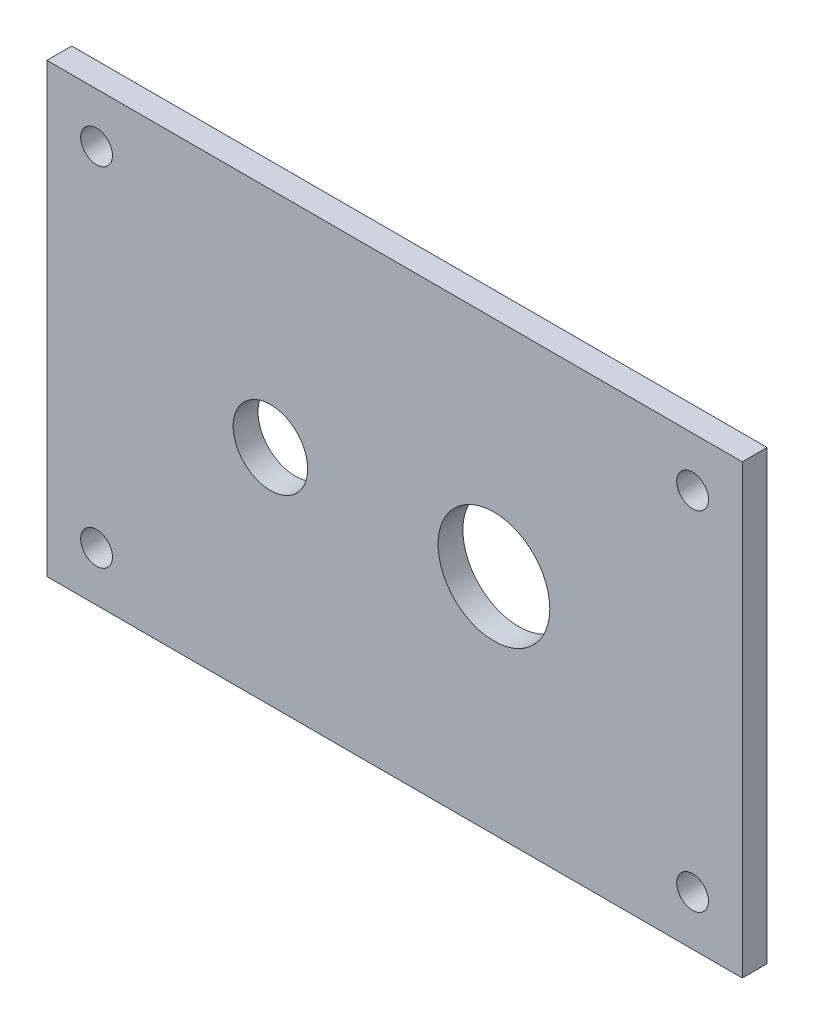
ISO-10303-21;
HEADER;
FILE_DESCRIPTION(('STEP AP214'),'2;1');
FILE_NAME('part.step','',(''),(''),'','','');
FILE_SCHEMA(('AUTOMOTIVE_DESIGN { 1 0 10303 214 1 1 1 1 }'));
ENDSEC;
DATA;
#1=APPLICATION_CONTEXT('core data for automotive mechanical design processes');
#2=APPLICATION_PROTOCOL_DEFINITION('international standard','automotive_design',2000,#1);
#3=PRODUCT_CONTEXT('',#1,'mechanical');
#4=PRODUCT('Part','Part','',(#3));
#5=PRODUCT_RELATED_PRODUCT_CATEGORY('part','',(#4));
#6=PRODUCT_DEFINITION_FORMATION('','',#4);
#7=PRODUCT_DEFINITION_CONTEXT('part definition',#1,'design');
#8=PRODUCT_DEFINITION('design','',#6,#7);
#9=PRODUCT_DEFINITION_SHAPE('','',#8);
#10=(LENGTH_UNIT() NAMED_UNIT(*) SI_UNIT(.MILLI.,.METRE.));
#11=(NAMED_UNIT(*) PLANE_ANGLE_UNIT() SI_UNIT($,.RADIAN.));
#12=(NAMED_UNIT(*) SI_UNIT($,.STERADIAN.) SOLID_ANGLE_UNIT());
#13=UNCERTAINTY_MEASURE_WITH_UNIT(LENGTH_MEASURE(1.E-05),#10,'distance_accuracy_value','');
#14=(GEOMETRIC_REPRESENTATION_CONTEXT(3) GLOBAL_UNCERTAINTY_ASSIGNED_CONTEXT((#13)) GLOBAL_UNIT_ASSIGNED_CONTEXT((#10,
#11,#12)) REPRESENTATION_CONTEXT('',''));
#15=CARTESIAN_POINT('',(0.,0.,0.));
#16=DIRECTION('',(0.,0.,1.));
#17=DIRECTION('',(1.,0.,0.));
#18=AXIS2_PLACEMENT_3D('',#15,#16,#17);
#19=CARTESIAN_POINT('',(0.,0.,3.175));
#20=DIRECTION('',(0.,0.,-1.));
#21=DIRECTION('',(-1.,0.,0.));
#22=AXIS2_PLACEMENT_3D('',#19,#20,#21);
#23=PLANE('',#22);
#24=DIRECTION('',(0.,1.,0.));
#25=VECTOR('',#24,1.);
#26=CARTESIAN_POINT('',(88.9,-57.15,3.175));
#27=LINE('',#26,#25);
#28=CARTESIAN_POINT('',(88.9,-57.15,3.175));
#29=VERTEX_POINT('',#28);
#30=CARTESIAN_POINT('',(88.9,57.15,3.175));
#31=VERTEX_POINT('',#30);
#32=EDGE_CURVE('E87',#29,#31,#27,.T.);
#33=ORIENTED_EDGE('',*,*,#32,.T.);
#34=DIRECTION('',(-1.,0.,0.));
#35=VECTOR('',#34,1.);
#36=CARTESIAN_POINT('',(-88.9,57.15,3.175));
#37=LINE('',#36,#35);
#38=CARTESIAN_POINT('',(-88.9,57.15,3.175));
#39=VERTEX_POINT('',#38);
#40=EDGE_CURVE('E82',#31,#39,#37,.T.);
#41=ORIENTED_EDGE('',*,*,#40,.T.);
#42=DIRECTION('',(0.,-1.,0.));
#43=VECTOR('',#42,1.);
#44=CARTESIAN_POINT('',(-88.9,-57.15,3.175));
#45=LINE('',#44,#43);
#46=CARTESIAN_POINT('',(-88.9,-57.15,3.175));
#47=VERTEX_POINT('',#46);
#48=EDGE_CURVE('E85',#39,#47,#45,.T.);
#49=ORIENTED_EDGE('',*,*,#48,.T.);
#50=DIRECTION('',(1.,0.,0.));
#51=VECTOR('',#50,1.);
#52=CARTESIAN_POINT('',(-88.9,-57.15,3.175));
#53=LINE('',#52,#51);
#54=EDGE_CURVE('E52',#47,#29,#53,.T.);
#55=ORIENTED_EDGE('',*,*,#54,.T.);
#56=EDGE_LOOP('',(#33,#41,#49,#55));
#57=FACE_BOUND('',#56,.T.);
#58=CARTESIAN_POINT('',(25.4,-2.76339623243204E-13,3.175));
#59=DIRECTION('',(0.,0.,1.));
#60=DIRECTION('',(1.,0.,0.));
#61=AXIS2_PLACEMENT_3D('',#58,#59,#60);
#62=CIRCLE('',#61,14.2875);
#63=CARTESIAN_POINT('',(39.6875,-2.76339623243204E-13,3.175));
#64=VERTEX_POINT('',#63);
#65=EDGE_CURVE('E102',#64,#64,#62,.T.);
#66=ORIENTED_EDGE('',*,*,#65,.F.);
#67=EDGE_LOOP('',(#66));
#68=FACE_BOUND('',#67,.T.);
#69=CARTESIAN_POINT('',(-31.75,-2.76339623243204E-13,3.175));
#70=DIRECTION('',(0.,0.,1.));
#71=DIRECTION('',(1.,0.,0.));
#72=AXIS2_PLACEMENT_3D('',#69,#70,#71);
#73=CIRCLE('',#72,9.525);
#74=CARTESIAN_POINT('',(-22.225,-2.76339623243204E-13,3.175));
#75=VERTEX_POINT('',#74);
#76=EDGE_CURVE('E117',#75,#75,#73,.T.);
#77=ORIENTED_EDGE('',*,*,#76,.F.);
#78=EDGE_LOOP('',(#77));
#79=FACE_BOUND('',#78,.T.);
#80=CARTESIAN_POINT('',(-76.2,44.45,3.175));
#81=DIRECTION('',(0.,0.,1.));
#82=DIRECTION('',(1.,0.,0.));
#83=AXIS2_PLACEMENT_3D('',#80,#81,#82);
#84=CIRCLE('',#83,4.064);
#85=CARTESIAN_POINT('',(-72.136,44.45,3.175));
#86=VERTEX_POINT('',#85);
#87=EDGE_CURVE('E123',#86,#86,#84,.T.);
#88=ORIENTED_EDGE('',*,*,#87,.F.);
#89=EDGE_LOOP('',(#88));
#90=FACE_BOUND('',#89,.T.);
#91=CARTESIAN_POINT('',(-76.2,-44.45,3.175));
#92=DIRECTION('',(0.,0.,1.));
#93=DIRECTION('',(-1.,0.,0.));
#94=AXIS2_PLACEMENT_3D('',#91,#92,#93);
#95=CIRCLE('',#94,4.064);
#96=CARTESIAN_POINT('',(-80.264,-44.45,3.175));
#97=VERTEX_POINT('',#96);
#98=EDGE_CURVE('E129',#97,#97,#95,.T.);
#99=ORIENTED_EDGE('',*,*,#98,.F.);
#100=EDGE_LOOP('',(#99));
#101=FACE_BOUND('',#100,.T.);
#102=CARTESIAN_POINT('',(76.2,44.4499999999995,3.175));
#103=DIRECTION('',(0.,0.,1.));
#104=DIRECTION('',(-1.,0.,0.));
#105=AXIS2_PLACEMENT_3D('',#102,#103,#104);
#106=CIRCLE('',#105,4.064);
#107=CARTESIAN_POINT('',(72.136,44.4499999999995,3.175));
#108=VERTEX_POINT('',#107);
#109=EDGE_CURVE('E135',#108,#108,#106,.T.);
#110=ORIENTED_EDGE('',*,*,#109,.F.);
#111=EDGE_LOOP('',(#110));
#112=FACE_BOUND('',#111,.T.);
#113=CARTESIAN_POINT('',(76.2,-44.4500000000004,3.175));
#114=DIRECTION('',(0.,0.,1.));
#115=DIRECTION('',(1.,0.,0.));
#116=AXIS2_PLACEMENT_3D('',#113,#114,#115);
#117=CIRCLE('',#116,4.064);
#118=CARTESIAN_POINT('',(80.264,-44.4500000000004,3.175));
#119=VERTEX_POINT('',#118);
#120=EDGE_CURVE('E141',#119,#119,#117,.T.);
#121=ORIENTED_EDGE('',*,*,#120,.F.);
#122=EDGE_LOOP('',(#121));
#123=FACE_BOUND('',#122,.T.);
#124=ADVANCED_FACE('F35',(#57,#68,#79,#90,#101,#112,#123),#23,.F.);
#125=CARTESIAN_POINT('',(0.,0.,-3.175));
#126=DIRECTION('',(0.,0.,-1.));
#127=DIRECTION('',(-1.,0.,0.));
#128=AXIS2_PLACEMENT_3D('',#125,#126,#127);
#129=PLANE('',#128);
#130=CARTESIAN_POINT('',(76.2,44.4499999999995,-3.175));
#131=DIRECTION('',(0.,0.,1.));
#132=DIRECTION('',(-1.,0.,0.));
#133=AXIS2_PLACEMENT_3D('',#130,#131,#132);
#134=CIRCLE('',#133,4.064);
#135=CARTESIAN_POINT('',(72.136,44.4499999999995,-3.175));
#136=VERTEX_POINT('',#135);
#137=EDGE_CURVE('E138',#136,#136,#134,.T.);
#138=ORIENTED_EDGE('',*,*,#137,.T.);
#139=EDGE_LOOP('',(#138));
#140=FACE_BOUND('',#139,.T.);
#141=CARTESIAN_POINT('',(-76.2,44.45,-3.175));
#142=DIRECTION('',(0.,0.,1.));
#143=DIRECTION('',(1.,0.,0.));
#144=AXIS2_PLACEMENT_3D('',#141,#142,#143);
#145=CIRCLE('',#144,4.064);
#146=CARTESIAN_POINT('',(-72.136,44.45,-3.175));
#147=VERTEX_POINT('',#146);
#148=EDGE_CURVE('E126',#147,#147,#145,.T.);
#149=ORIENTED_EDGE('',*,*,#148,.T.);
#150=EDGE_LOOP('',(#149));
#151=FACE_BOUND('',#150,.T.);
#152=CARTESIAN_POINT('',(25.4,-2.76339623243204E-13,-3.175));
#153=DIRECTION('',(0.,0.,1.));
#154=DIRECTION('',(1.,0.,0.));
#155=AXIS2_PLACEMENT_3D('',#152,#153,#154);
#156=CIRCLE('',#155,14.2875);
#157=CARTESIAN_POINT('',(39.6875,-2.76339623243204E-13,-3.175));
#158=VERTEX_POINT('',#157);
#159=EDGE_CURVE('E114',#158,#158,#156,.T.);
#160=ORIENTED_EDGE('',*,*,#159,.T.);
#161=EDGE_LOOP('',(#160));
#162=FACE_BOUND('',#161,.T.);
#163=DIRECTION('',(0.,1.,0.));
#164=VECTOR('',#163,1.);
#165=CARTESIAN_POINT('',(88.9,-57.15,-3.175));
#166=LINE('',#165,#164);
#167=CARTESIAN_POINT('',(88.9,-57.15,-3.175));
#168=VERTEX_POINT('',#167);
#169=CARTESIAN_POINT('',(88.9,57.15,-3.175));
#170=VERTEX_POINT('',#169);
#171=EDGE_CURVE('E99',#168,#170,#166,.T.);
#172=ORIENTED_EDGE('',*,*,#171,.F.);
#173=DIRECTION('',(1.,0.,0.));
#174=VECTOR('',#173,1.);
#175=CARTESIAN_POINT('',(-88.9,-57.15,-3.175));
#176=LINE('',#175,#174);
#177=CARTESIAN_POINT('',(-88.9,-57.15,-3.175));
#178=VERTEX_POINT('',#177);
#179=EDGE_CURVE('E75',#178,#168,#176,.T.);
#180=ORIENTED_EDGE('',*,*,#179,.F.);
#181=DIRECTION('',(0.,-1.,0.));
#182=VECTOR('',#181,1.);
#183=CARTESIAN_POINT('',(-88.9,-57.15,-3.175));
#184=LINE('',#183,#182);
#185=CARTESIAN_POINT('',(-88.9,57.15,-3.175));
#186=VERTEX_POINT('',#185);
#187=EDGE_CURVE('E69',#186,#178,#184,.T.);
#188=ORIENTED_EDGE('',*,*,#187,.F.);
#189=DIRECTION('',(-1.,0.,0.));
#190=VECTOR('',#189,1.);
#191=CARTESIAN_POINT('',(-88.9,57.15,-3.175));
#192=LINE('',#191,#190);
#193=EDGE_CURVE('E91',#170,#186,#192,.T.);
#194=ORIENTED_EDGE('',*,*,#193,.F.);
#195=EDGE_LOOP('',(#172,#180,#188,#194));
#196=FACE_BOUND('',#195,.T.);
#197=CARTESIAN_POINT('',(-31.75,-2.76339623243204E-13,-3.175));
#198=DIRECTION('',(0.,0.,1.));
#199=DIRECTION('',(1.,0.,0.));
#200=AXIS2_PLACEMENT_3D('',#197,#198,#199);
#201=CIRCLE('',#200,9.525);
#202=CARTESIAN_POINT('',(-22.225,-2.76339623243204E-13,-3.175));
#203=VERTEX_POINT('',#202);
#204=EDGE_CURVE('E120',#203,#203,#201,.T.);
#205=ORIENTED_EDGE('',*,*,#204,.T.);
#206=EDGE_LOOP('',(#205));
#207=FACE_BOUND('',#206,.T.);
#208=CARTESIAN_POINT('',(-76.2,-44.45,-3.175));
#209=DIRECTION('',(0.,0.,1.));
#210=DIRECTION('',(-1.,0.,0.));
#211=AXIS2_PLACEMENT_3D('',#208,#209,#210);
#212=CIRCLE('',#211,4.064);
#213=CARTESIAN_POINT('',(-80.264,-44.45,-3.175));
#214=VERTEX_POINT('',#213);
#215=EDGE_CURVE('E132',#214,#214,#212,.T.);
#216=ORIENTED_EDGE('',*,*,#215,.T.);
#217=EDGE_LOOP('',(#216));
#218=FACE_BOUND('',#217,.T.);
#219=CARTESIAN_POINT('',(76.2,-44.4500000000004,-3.175));
#220=DIRECTION('',(0.,0.,1.));
#221=DIRECTION('',(1.,0.,0.));
#222=AXIS2_PLACEMENT_3D('',#219,#220,#221);
#223=CIRCLE('',#222,4.064);
#224=CARTESIAN_POINT('',(80.264,-44.4500000000004,-3.175));
#225=VERTEX_POINT('',#224);
#226=EDGE_CURVE('E144',#225,#225,#223,.T.);
#227=ORIENTED_EDGE('',*,*,#226,.T.);
#228=EDGE_LOOP('',(#227));
#229=FACE_BOUND('',#228,.T.);
#230=ADVANCED_FACE('F110',(#140,#151,#162,#196,#207,#218,#229),#129,.T.);
#231=CARTESIAN_POINT('',(88.9,-57.15,3.175));
#232=DIRECTION('',(-1.,0.,0.));
#233=DIRECTION('',(0.,0.,1.));
#234=AXIS2_PLACEMENT_3D('',#231,#232,#233);
#235=PLANE('',#234);
#236=ORIENTED_EDGE('',*,*,#171,.T.);
#237=DIRECTION('',(0.,0.,-1.));
#238=VECTOR('',#237,1.);
#239=CARTESIAN_POINT('',(88.9,57.15,3.175));
#240=LINE('',#239,#238);
#241=EDGE_CURVE('E11',#31,#170,#240,.T.);
#242=ORIENTED_EDGE('',*,*,#241,.F.);
#243=ORIENTED_EDGE('',*,*,#32,.F.);
#244=DIRECTION('',(0.,0.,-1.));
#245=VECTOR('',#244,1.);
#246=CARTESIAN_POINT('',(88.9,-57.15,3.175));
#247=LINE('',#246,#245);
#248=EDGE_CURVE('E95',#29,#168,#247,.T.);
#249=ORIENTED_EDGE('',*,*,#248,.T.);
#250=EDGE_LOOP('',(#236,#242,#243,#249));
#251=FACE_BOUND('',#250,.T.);
#252=ADVANCED_FACE('F37',(#251),#235,.F.);
#253=CARTESIAN_POINT('',(-88.9,57.15,3.175));
#254=DIRECTION('',(0.,-1.,0.));
#255=DIRECTION('',(0.,0.,-1.));
#256=AXIS2_PLACEMENT_3D('',#253,#254,#255);
#257=PLANE('',#256);
#258=ORIENTED_EDGE('',*,*,#193,.T.);
#259=DIRECTION('',(0.,0.,-1.));
#260=VECTOR('',#259,1.);
#261=CARTESIAN_POINT('',(-88.9,57.15,3.175));
#262=LINE('',#261,#260);
#263=EDGE_CURVE('E44',#39,#186,#262,.T.);
#264=ORIENTED_EDGE('',*,*,#263,.F.);
#265=ORIENTED_EDGE('',*,*,#40,.F.);
#266=ORIENTED_EDGE('',*,*,#241,.T.);
#267=EDGE_LOOP('',(#258,#264,#265,#266));
#268=FACE_BOUND('',#267,.T.);
#269=ADVANCED_FACE('F90',(#268),#257,.F.);
#270=CARTESIAN_POINT('',(-88.9,-57.15,3.175));
#271=DIRECTION('',(1.,0.,0.));
#272=DIRECTION('',(0.,0.,-1.));
#273=AXIS2_PLACEMENT_3D('',#270,#271,#272);
#274=PLANE('',#273);
#275=ORIENTED_EDGE('',*,*,#187,.T.);
#276=DIRECTION('',(0.,0.,-1.));
#277=VECTOR('',#276,1.);
#278=CARTESIAN_POINT('',(-88.9,-57.15,3.175));
#279=LINE('',#278,#277);
#280=EDGE_CURVE('E92',#47,#178,#279,.T.);
#281=ORIENTED_EDGE('',*,*,#280,.F.);
#282=ORIENTED_EDGE('',*,*,#48,.F.);
#283=ORIENTED_EDGE('',*,*,#263,.T.);
#284=EDGE_LOOP('',(#275,#281,#282,#283));
#285=FACE_BOUND('',#284,.T.);
#286=ADVANCED_FACE('F93',(#285),#274,.F.);
#287=CARTESIAN_POINT('',(-88.9,-57.15,3.175));
#288=DIRECTION('',(0.,1.,0.));
#289=DIRECTION('',(0.,0.,1.));
#290=AXIS2_PLACEMENT_3D('',#287,#288,#289);
#291=PLANE('',#290);
#292=ORIENTED_EDGE('',*,*,#179,.T.);
#293=ORIENTED_EDGE('',*,*,#248,.F.);
#294=ORIENTED_EDGE('',*,*,#54,.F.);
#295=ORIENTED_EDGE('',*,*,#280,.T.);
#296=EDGE_LOOP('',(#292,#293,#294,#295));
#297=FACE_BOUND('',#296,.T.);
#298=ADVANCED_FACE('F107',(#297),#291,.F.);
#299=CARTESIAN_POINT('',(25.4,-2.76339623243204E-13,3.175));
#300=DIRECTION('',(0.,0.,-1.));
#301=DIRECTION('',(-1.,0.,0.));
#302=AXIS2_PLACEMENT_3D('',#299,#300,#301);
#303=CYLINDRICAL_SURFACE('',#302,14.2875);
#304=ORIENTED_EDGE('',*,*,#65,.T.);
#305=EDGE_LOOP('',(#304));
#306=FACE_BOUND('',#305,.T.);
#307=ORIENTED_EDGE('',*,*,#159,.F.);
#308=EDGE_LOOP('',(#307));
#309=FACE_BOUND('',#308,.T.);
#310=ADVANCED_FACE('F161',(#306,#309),#303,.F.);
#311=CARTESIAN_POINT('',(-31.75,-2.76339623243204E-13,3.175));
#312=DIRECTION('',(0.,0.,-1.));
#313=DIRECTION('',(-1.,0.,0.));
#314=AXIS2_PLACEMENT_3D('',#311,#312,#313);
#315=CYLINDRICAL_SURFACE('',#314,9.525);
#316=ORIENTED_EDGE('',*,*,#76,.T.);
#317=EDGE_LOOP('',(#316));
#318=FACE_BOUND('',#317,.T.);
#319=ORIENTED_EDGE('',*,*,#204,.F.);
#320=EDGE_LOOP('',(#319));
#321=FACE_BOUND('',#320,.T.);
#322=ADVANCED_FACE('F207',(#318,#321),#315,.F.);
#323=CARTESIAN_POINT('',(-76.2,44.45,3.175));
#324=DIRECTION('',(0.,0.,-1.));
#325=DIRECTION('',(-1.,0.,0.));
#326=AXIS2_PLACEMENT_3D('',#323,#324,#325);
#327=CYLINDRICAL_SURFACE('',#326,4.064);
#328=ORIENTED_EDGE('',*,*,#87,.T.);
#329=EDGE_LOOP('',(#328));
#330=FACE_BOUND('',#329,.T.);
#331=ORIENTED_EDGE('',*,*,#148,.F.);
#332=EDGE_LOOP('',(#331));
#333=FACE_BOUND('',#332,.T.);
#334=ADVANCED_FACE('F215',(#330,#333),#327,.F.);
#335=CARTESIAN_POINT('',(-76.2,-44.45,3.175));
#336=DIRECTION('',(0.,0.,-1.));
#337=DIRECTION('',(-1.,0.,0.));
#338=AXIS2_PLACEMENT_3D('',#335,#336,#337);
#339=CYLINDRICAL_SURFACE('',#338,4.064);
#340=ORIENTED_EDGE('',*,*,#98,.T.);
#341=EDGE_LOOP('',(#340));
#342=FACE_BOUND('',#341,.T.);
#343=ORIENTED_EDGE('',*,*,#215,.F.);
#344=EDGE_LOOP('',(#343));
#345=FACE_BOUND('',#344,.T.);
#346=ADVANCED_FACE('F223',(#342,#345),#339,.F.);
#347=CARTESIAN_POINT('',(76.2,44.4499999999995,3.175));
#348=DIRECTION('',(0.,0.,-1.));
#349=DIRECTION('',(-1.,0.,0.));
#350=AXIS2_PLACEMENT_3D('',#347,#348,#349);
#351=CYLINDRICAL_SURFACE('',#350,4.064);
#352=ORIENTED_EDGE('',*,*,#109,.T.);
#353=EDGE_LOOP('',(#352));
#354=FACE_BOUND('',#353,.T.);
#355=ORIENTED_EDGE('',*,*,#137,.F.);
#356=EDGE_LOOP('',(#355));
#357=FACE_BOUND('',#356,.T.);
#358=ADVANCED_FACE('F232',(#354,#357),#351,.F.);
#359=CARTESIAN_POINT('',(76.2,-44.4500000000004,3.175));
#360=DIRECTION('',(0.,0.,-1.));
#361=DIRECTION('',(-1.,0.,0.));
#362=AXIS2_PLACEMENT_3D('',#359,#360,#361);
#363=CYLINDRICAL_SURFACE('',#362,4.064);
#364=ORIENTED_EDGE('',*,*,#120,.T.);
#365=EDGE_LOOP('',(#364));
#366=FACE_BOUND('',#365,.T.);
#367=ORIENTED_EDGE('',*,*,#226,.F.);
#368=EDGE_LOOP('',(#367));
#369=FACE_BOUND('',#368,.T.);
#370=ADVANCED_FACE('F150',(#366,#369),#363,.F.);
#371=CLOSED_SHELL('',(#124,#230,#252,#269,#286,#298,#310,#322,#334,#346,#358,#370));
#372=MANIFOLD_SOLID_BREP('B2',#371);
#373=ADVANCED_BREP_SHAPE_REPRESENTATION('',(#18,#372),#14);
#374=SHAPE_DEFINITION_REPRESENTATION(#9,#373);
ENDSEC;
END-ISO-10303-21;
